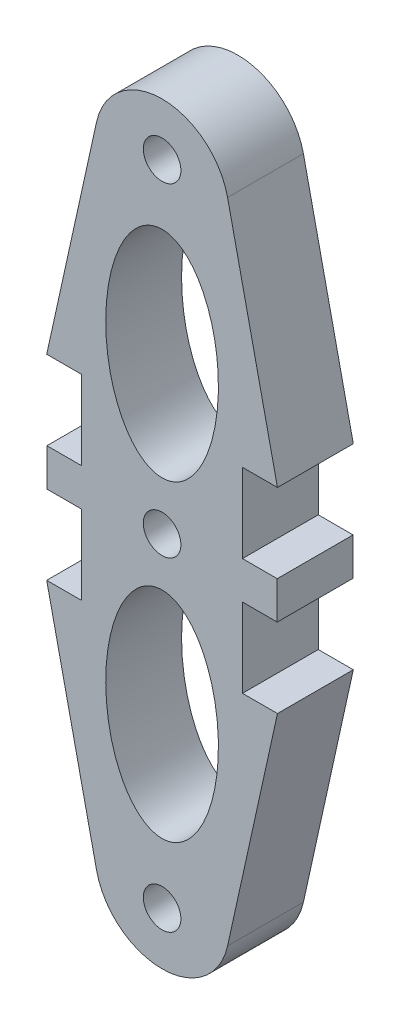
ISO-10303-21;
HEADER;
FILE_DESCRIPTION(('STEP AP214'),'2;1');
FILE_NAME('part.step','',(''),(''),'','','');
FILE_SCHEMA(('AUTOMOTIVE_DESIGN { 1 0 10303 214 1 1 1 1 }'));
ENDSEC;
DATA;
#1=APPLICATION_CONTEXT('core data for automotive mechanical design processes');
#2=APPLICATION_PROTOCOL_DEFINITION('international standard','automotive_design',2000,#1);
#3=PRODUCT_CONTEXT('',#1,'mechanical');
#4=PRODUCT('Part','Part','',(#3));
#5=PRODUCT_RELATED_PRODUCT_CATEGORY('part','',(#4));
#6=PRODUCT_DEFINITION_FORMATION('','',#4);
#7=PRODUCT_DEFINITION_CONTEXT('part definition',#1,'design');
#8=PRODUCT_DEFINITION('design','',#6,#7);
#9=PRODUCT_DEFINITION_SHAPE('','',#8);
#10=(LENGTH_UNIT() NAMED_UNIT(*) SI_UNIT(.MILLI.,.METRE.));
#11=(NAMED_UNIT(*) PLANE_ANGLE_UNIT() SI_UNIT($,.RADIAN.));
#12=(NAMED_UNIT(*) SI_UNIT($,.STERADIAN.) SOLID_ANGLE_UNIT());
#13=UNCERTAINTY_MEASURE_WITH_UNIT(LENGTH_MEASURE(1.E-05),#10,'distance_accuracy_value','');
#14=(GEOMETRIC_REPRESENTATION_CONTEXT(3) GLOBAL_UNCERTAINTY_ASSIGNED_CONTEXT((#13)) GLOBAL_UNIT_ASSIGNED_CONTEXT((#10,
#11,#12)) REPRESENTATION_CONTEXT('',''));
#15=CARTESIAN_POINT('',(0.,0.,0.));
#16=DIRECTION('',(0.,0.,1.));
#17=DIRECTION('',(1.,0.,0.));
#18=AXIS2_PLACEMENT_3D('',#15,#16,#17);
#19=CARTESIAN_POINT('',(787.554942027918,415.958636761701,5.85));
#20=DIRECTION('',(0.976545974076445,0.215308988467939,0.));
#21=DIRECTION('',(-0.215308988467939,0.976545974076445,0.));
#22=AXIS2_PLACEMENT_3D('',#19,#20,#21);
#23=PLANE('',#22);
#24=DIRECTION('',(0.215308988467939,-0.976545974076445,0.));
#25=VECTOR('',#24,1.);
#26=CARTESIAN_POINT('',(787.554942027918,415.958636761701,0.));
#27=LINE('',#26,#25);
#28=CARTESIAN_POINT('',(778.759168708765,455.852359196733,0.));
#29=VERTEX_POINT('',#28);
#30=CARTESIAN_POINT('',(782.606547069337,438.402359196733,0.));
#31=VERTEX_POINT('',#30);
#32=EDGE_CURVE('E313',#29,#31,#27,.T.);
#33=ORIENTED_EDGE('',*,*,#32,.T.);
#34=DIRECTION('',(0.,0.,-1.));
#35=VECTOR('',#34,1.);
#36=CARTESIAN_POINT('',(782.606547069337,438.402359196733,5.85));
#37=LINE('',#36,#35);
#38=CARTESIAN_POINT('',(782.606547069337,438.402359196733,5.85));
#39=VERTEX_POINT('',#38);
#40=EDGE_CURVE('E11',#39,#31,#37,.T.);
#41=ORIENTED_EDGE('',*,*,#40,.F.);
#42=DIRECTION('',(0.215308988467939,-0.976545974076445,0.));
#43=VECTOR('',#42,1.);
#44=CARTESIAN_POINT('',(787.554942027918,415.958636761701,5.85));
#45=LINE('',#44,#43);
#46=CARTESIAN_POINT('',(778.759168708765,455.852359196733,5.85));
#47=VERTEX_POINT('',#46);
#48=EDGE_CURVE('E468',#47,#39,#45,.T.);
#49=ORIENTED_EDGE('',*,*,#48,.F.);
#50=DIRECTION('',(0.,0.,-1.));
#51=VECTOR('',#50,1.);
#52=CARTESIAN_POINT('',(778.759168708765,455.852359196733,5.85));
#53=LINE('',#52,#51);
#54=EDGE_CURVE('E378',#47,#29,#53,.T.);
#55=ORIENTED_EDGE('',*,*,#54,.T.);
#56=EDGE_LOOP('',(#33,#41,#49,#55));
#57=FACE_BOUND('',#56,.T.);
#58=ADVANCED_FACE('F34',(#57),#23,.F.);
#59=CARTESIAN_POINT('',(787.659168708765,439.516361899294,5.85));
#60=DIRECTION('',(0.,0.,-1.));
#61=DIRECTION('',(-1.,0.,0.));
#62=AXIS2_PLACEMENT_3D('',#59,#60,#61);
#63=CYLINDRICAL_SURFACE('',#62,5.17397211555384);
#64=CARTESIAN_POINT('',(787.659168708765,439.516361899294,0.));
#65=DIRECTION('',(0.,0.,1.));
#66=DIRECTION('',(1.,0.,0.));
#67=AXIS2_PLACEMENT_3D('',#64,#65,#66);
#68=CIRCLE('',#67,5.17397211555384);
#69=CARTESIAN_POINT('',(792.711790348193,438.402359196733,0.));
#70=VERTEX_POINT('',#69);
#71=EDGE_CURVE('E317',#31,#70,#68,.T.);
#72=ORIENTED_EDGE('',*,*,#71,.T.);
#73=DIRECTION('',(0.,0.,-1.));
#74=VECTOR('',#73,1.);
#75=CARTESIAN_POINT('',(792.711790348193,438.402359196733,5.85));
#76=LINE('',#75,#74);
#77=CARTESIAN_POINT('',(792.711790348193,438.402359196733,5.85));
#78=VERTEX_POINT('',#77);
#79=EDGE_CURVE('E43',#78,#70,#76,.T.);
#80=ORIENTED_EDGE('',*,*,#79,.F.);
#81=CARTESIAN_POINT('',(787.659168708765,439.516361899294,5.85));
#82=DIRECTION('',(0.,0.,1.));
#83=DIRECTION('',(1.,0.,0.));
#84=AXIS2_PLACEMENT_3D('',#81,#82,#83);
#85=CIRCLE('',#84,5.17397211555384);
#86=EDGE_CURVE('E129',#39,#78,#85,.T.);
#87=ORIENTED_EDGE('',*,*,#86,.F.);
#88=ORIENTED_EDGE('',*,*,#40,.T.);
#89=EDGE_LOOP('',(#72,#80,#87,#88));
#90=FACE_BOUND('',#89,.T.);
#91=ADVANCED_FACE('F293',(#90),#63,.T.);
#92=CARTESIAN_POINT('',(787.763395389613,415.958636761701,5.85));
#93=DIRECTION('',(-0.976545974076445,0.215308988467939,0.));
#94=DIRECTION('',(-0.215308988467939,-0.976545974076445,0.));
#95=AXIS2_PLACEMENT_3D('',#92,#93,#94);
#96=PLANE('',#95);
#97=DIRECTION('',(0.215308988467939,0.976545974076445,0.));
#98=VECTOR('',#97,1.);
#99=CARTESIAN_POINT('',(787.763395389613,415.958636761701,0.));
#100=LINE('',#99,#98);
#101=CARTESIAN_POINT('',(796.559168708765,455.852359196733,0.));
#102=VERTEX_POINT('',#101);
#103=EDGE_CURVE('E322',#70,#102,#100,.T.);
#104=ORIENTED_EDGE('',*,*,#103,.T.);
#105=DIRECTION('',(0.,0.,-1.));
#106=VECTOR('',#105,1.);
#107=CARTESIAN_POINT('',(796.559168708765,455.852359196733,5.85));
#108=LINE('',#107,#106);
#109=CARTESIAN_POINT('',(796.559168708765,455.852359196733,5.85));
#110=VERTEX_POINT('',#109);
#111=EDGE_CURVE('E410',#110,#102,#108,.T.);
#112=ORIENTED_EDGE('',*,*,#111,.F.);
#113=DIRECTION('',(0.215308988467939,0.976545974076445,0.));
#114=VECTOR('',#113,1.);
#115=CARTESIAN_POINT('',(787.763395389613,415.958636761701,5.85));
#116=LINE('',#115,#114);
#117=EDGE_CURVE('E415',#78,#110,#116,.T.);
#118=ORIENTED_EDGE('',*,*,#117,.F.);
#119=ORIENTED_EDGE('',*,*,#79,.T.);
#120=EDGE_LOOP('',(#104,#112,#118,#119));
#121=FACE_BOUND('',#120,.T.);
#122=ADVANCED_FACE('F289',(#121),#96,.F.);
#123=CARTESIAN_POINT('',(787.659168708766,455.852359196733,5.85));
#124=DIRECTION('',(0.,1.,0.));
#125=DIRECTION('',(-1.,0.,0.));
#126=AXIS2_PLACEMENT_3D('',#123,#124,#125);
#127=PLANE('',#126);
#128=DIRECTION('',(1.,0.,0.));
#129=VECTOR('',#128,1.);
#130=CARTESIAN_POINT('',(787.659168708766,455.852359196733,0.));
#131=LINE('',#130,#129);
#132=CARTESIAN_POINT('',(793.859168708765,455.852359196733,0.));
#133=VERTEX_POINT('',#132);
#134=EDGE_CURVE('E325',#133,#102,#131,.T.);
#135=ORIENTED_EDGE('',*,*,#134,.F.);
#136=DIRECTION('',(0.,0.,-1.));
#137=VECTOR('',#136,1.);
#138=CARTESIAN_POINT('',(793.859168708765,455.852359196733,5.85));
#139=LINE('',#138,#137);
#140=CARTESIAN_POINT('',(793.859168708765,455.852359196733,5.85));
#141=VERTEX_POINT('',#140);
#142=EDGE_CURVE('E408',#141,#133,#139,.T.);
#143=ORIENTED_EDGE('',*,*,#142,.F.);
#144=DIRECTION('',(1.,0.,0.));
#145=VECTOR('',#144,1.);
#146=CARTESIAN_POINT('',(787.659168708766,455.852359196733,5.85));
#147=LINE('',#146,#145);
#148=EDGE_CURVE('E425',#141,#110,#147,.T.);
#149=ORIENTED_EDGE('',*,*,#148,.T.);
#150=ORIENTED_EDGE('',*,*,#111,.T.);
#151=EDGE_LOOP('',(#135,#143,#149,#150));
#152=FACE_BOUND('',#151,.T.);
#153=ADVANCED_FACE('F285',(#152),#127,.T.);
#154=CARTESIAN_POINT('',(793.859168708765,415.981616674393,5.85));
#155=DIRECTION('',(1.,0.,0.));
#156=DIRECTION('',(0.,0.,-1.));
#157=AXIS2_PLACEMENT_3D('',#154,#155,#156);
#158=PLANE('',#157);
#159=DIRECTION('',(0.,-1.,0.));
#160=VECTOR('',#159,1.);
#161=CARTESIAN_POINT('',(793.859168708765,415.981616674393,0.));
#162=LINE('',#161,#160);
#163=CARTESIAN_POINT('',(793.859168708765,461.952359196733,0.));
#164=VERTEX_POINT('',#163);
#165=EDGE_CURVE('E328',#164,#133,#162,.T.);
#166=ORIENTED_EDGE('',*,*,#165,.F.);
#167=DIRECTION('',(0.,0.,-1.));
#168=VECTOR('',#167,1.);
#169=CARTESIAN_POINT('',(793.859168708765,461.952359196733,5.85));
#170=LINE('',#169,#168);
#171=CARTESIAN_POINT('',(793.859168708765,461.952359196733,5.85));
#172=VERTEX_POINT('',#171);
#173=EDGE_CURVE('E406',#172,#164,#170,.T.);
#174=ORIENTED_EDGE('',*,*,#173,.F.);
#175=DIRECTION('',(0.,-1.,0.));
#176=VECTOR('',#175,1.);
#177=CARTESIAN_POINT('',(793.859168708765,415.981616674393,5.85));
#178=LINE('',#177,#176);
#179=EDGE_CURVE('E428',#172,#141,#178,.T.);
#180=ORIENTED_EDGE('',*,*,#179,.T.);
#181=ORIENTED_EDGE('',*,*,#142,.T.);
#182=EDGE_LOOP('',(#166,#174,#180,#181));
#183=FACE_BOUND('',#182,.T.);
#184=ADVANCED_FACE('F281',(#183),#158,.T.);
#185=CARTESIAN_POINT('',(787.659168708766,461.952359196733,5.85));
#186=DIRECTION('',(0.,1.,0.));
#187=DIRECTION('',(-1.,0.,0.));
#188=AXIS2_PLACEMENT_3D('',#185,#186,#187);
#189=PLANE('',#188);
#190=DIRECTION('',(1.,0.,0.));
#191=VECTOR('',#190,1.);
#192=CARTESIAN_POINT('',(787.659168708766,461.952359196733,0.));
#193=LINE('',#192,#191);
#194=CARTESIAN_POINT('',(796.542244464242,461.952359196733,0.));
#195=VERTEX_POINT('',#194);
#196=EDGE_CURVE('E331',#164,#195,#193,.T.);
#197=ORIENTED_EDGE('',*,*,#196,.T.);
#198=DIRECTION('',(0.,0.,-1.));
#199=VECTOR('',#198,1.);
#200=CARTESIAN_POINT('',(796.542244464242,461.952359196733,5.85));
#201=LINE('',#200,#199);
#202=CARTESIAN_POINT('',(796.542244464242,461.952359196733,5.85));
#203=VERTEX_POINT('',#202);
#204=EDGE_CURVE('E404',#203,#195,#201,.T.);
#205=ORIENTED_EDGE('',*,*,#204,.F.);
#206=DIRECTION('',(1.,0.,0.));
#207=VECTOR('',#206,1.);
#208=CARTESIAN_POINT('',(787.659168708766,461.952359196733,5.85));
#209=LINE('',#208,#207);
#210=EDGE_CURVE('E430',#172,#203,#209,.T.);
#211=ORIENTED_EDGE('',*,*,#210,.F.);
#212=ORIENTED_EDGE('',*,*,#173,.T.);
#213=EDGE_LOOP('',(#197,#205,#211,#212));
#214=FACE_BOUND('',#213,.T.);
#215=ADVANCED_FACE('F277',(#214),#189,.F.);
#216=CARTESIAN_POINT('',(796.542244464242,415.981616674393,5.85));
#217=DIRECTION('',(1.,0.,0.));
#218=DIRECTION('',(0.,0.,-1.));
#219=AXIS2_PLACEMENT_3D('',#216,#217,#218);
#220=PLANE('',#219);
#221=DIRECTION('',(0.,-1.,0.));
#222=VECTOR('',#221,1.);
#223=CARTESIAN_POINT('',(796.542244464242,415.981616674393,0.));
#224=LINE('',#223,#222);
#225=CARTESIAN_POINT('',(796.542244464242,464.852359196733,0.));
#226=VERTEX_POINT('',#225);
#227=EDGE_CURVE('E334',#226,#195,#224,.T.);
#228=ORIENTED_EDGE('',*,*,#227,.F.);
#229=DIRECTION('',(0.,0.,-1.));
#230=VECTOR('',#229,1.);
#231=CARTESIAN_POINT('',(796.542244464242,464.852359196733,5.85));
#232=LINE('',#231,#230);
#233=CARTESIAN_POINT('',(796.542244464242,464.852359196733,5.85));
#234=VERTEX_POINT('',#233);
#235=EDGE_CURVE('E402',#234,#226,#232,.T.);
#236=ORIENTED_EDGE('',*,*,#235,.F.);
#237=DIRECTION('',(0.,-1.,0.));
#238=VECTOR('',#237,1.);
#239=CARTESIAN_POINT('',(796.542244464242,415.981616674393,5.85));
#240=LINE('',#239,#238);
#241=EDGE_CURVE('E436',#234,#203,#240,.T.);
#242=ORIENTED_EDGE('',*,*,#241,.T.);
#243=ORIENTED_EDGE('',*,*,#204,.T.);
#244=EDGE_LOOP('',(#228,#236,#242,#243));
#245=FACE_BOUND('',#244,.T.);
#246=ADVANCED_FACE('F273',(#245),#220,.T.);
#247=CARTESIAN_POINT('',(787.659168708764,464.852359196733,5.85));
#248=DIRECTION('',(0.,1.,0.));
#249=DIRECTION('',(-1.,0.,0.));
#250=AXIS2_PLACEMENT_3D('',#247,#248,#249);
#251=PLANE('',#250);
#252=DIRECTION('',(1.,0.,0.));
#253=VECTOR('',#252,1.);
#254=CARTESIAN_POINT('',(787.659168708764,464.852359196733,0.));
#255=LINE('',#254,#253);
#256=CARTESIAN_POINT('',(793.859168708765,464.852359196733,0.));
#257=VERTEX_POINT('',#256);
#258=EDGE_CURVE('E337',#257,#226,#255,.T.);
#259=ORIENTED_EDGE('',*,*,#258,.F.);
#260=DIRECTION('',(0.,0.,-1.));
#261=VECTOR('',#260,1.);
#262=CARTESIAN_POINT('',(793.859168708765,464.852359196733,5.85));
#263=LINE('',#262,#261);
#264=CARTESIAN_POINT('',(793.859168708765,464.852359196733,5.85));
#265=VERTEX_POINT('',#264);
#266=EDGE_CURVE('E400',#265,#257,#263,.T.);
#267=ORIENTED_EDGE('',*,*,#266,.F.);
#268=DIRECTION('',(1.,0.,0.));
#269=VECTOR('',#268,1.);
#270=CARTESIAN_POINT('',(787.659168708764,464.852359196733,5.85));
#271=LINE('',#270,#269);
#272=EDGE_CURVE('E439',#265,#234,#271,.T.);
#273=ORIENTED_EDGE('',*,*,#272,.T.);
#274=ORIENTED_EDGE('',*,*,#235,.T.);
#275=EDGE_LOOP('',(#259,#267,#273,#274));
#276=FACE_BOUND('',#275,.T.);
#277=ADVANCED_FACE('F269',(#276),#251,.T.);
#278=CARTESIAN_POINT('',(793.859168708765,415.981616674393,5.85));
#279=DIRECTION('',(-1.,0.,0.));
#280=DIRECTION('',(0.,0.,1.));
#281=AXIS2_PLACEMENT_3D('',#278,#279,#280);
#282=PLANE('',#281);
#283=DIRECTION('',(0.,1.,0.));
#284=VECTOR('',#283,1.);
#285=CARTESIAN_POINT('',(793.859168708765,415.981616674393,0.));
#286=LINE('',#285,#284);
#287=CARTESIAN_POINT('',(793.859168708765,470.952359196733,0.));
#288=VERTEX_POINT('',#287);
#289=EDGE_CURVE('E340',#257,#288,#286,.T.);
#290=ORIENTED_EDGE('',*,*,#289,.T.);
#291=DIRECTION('',(0.,0.,-1.));
#292=VECTOR('',#291,1.);
#293=CARTESIAN_POINT('',(793.859168708765,470.952359196733,5.85));
#294=LINE('',#293,#292);
#295=CARTESIAN_POINT('',(793.859168708765,470.952359196733,5.85));
#296=VERTEX_POINT('',#295);
#297=EDGE_CURVE('E397',#296,#288,#294,.T.);
#298=ORIENTED_EDGE('',*,*,#297,.F.);
#299=DIRECTION('',(0.,1.,0.));
#300=VECTOR('',#299,1.);
#301=CARTESIAN_POINT('',(793.859168708765,415.981616674393,5.85));
#302=LINE('',#301,#300);
#303=EDGE_CURVE('E442',#265,#296,#302,.T.);
#304=ORIENTED_EDGE('',*,*,#303,.F.);
#305=ORIENTED_EDGE('',*,*,#266,.T.);
#306=EDGE_LOOP('',(#290,#298,#304,#305));
#307=FACE_BOUND('',#306,.T.);
#308=ADVANCED_FACE('F265',(#307),#282,.F.);
#309=CARTESIAN_POINT('',(787.659168708764,470.952359196733,5.85));
#310=DIRECTION('',(0.,1.,0.));
#311=DIRECTION('',(-1.,0.,0.));
#312=AXIS2_PLACEMENT_3D('',#309,#310,#311);
#313=PLANE('',#312);
#314=DIRECTION('',(1.,0.,0.));
#315=VECTOR('',#314,1.);
#316=CARTESIAN_POINT('',(787.659168708764,470.952359196733,0.));
#317=LINE('',#316,#315);
#318=CARTESIAN_POINT('',(796.559168708765,470.952359196733,0.));
#319=VERTEX_POINT('',#318);
#320=EDGE_CURVE('E342',#288,#319,#317,.T.);
#321=ORIENTED_EDGE('',*,*,#320,.T.);
#322=DIRECTION('',(0.,0.,-1.));
#323=VECTOR('',#322,1.);
#324=CARTESIAN_POINT('',(796.559168708765,470.952359196733,5.85));
#325=LINE('',#324,#323);
#326=CARTESIAN_POINT('',(796.559168708765,470.952359196733,5.85));
#327=VERTEX_POINT('',#326);
#328=EDGE_CURVE('E395',#327,#319,#325,.T.);
#329=ORIENTED_EDGE('',*,*,#328,.F.);
#330=DIRECTION('',(1.,0.,0.));
#331=VECTOR('',#330,1.);
#332=CARTESIAN_POINT('',(787.659168708764,470.952359196733,5.85));
#333=LINE('',#332,#331);
#334=EDGE_CURVE('E444',#296,#327,#333,.T.);
#335=ORIENTED_EDGE('',*,*,#334,.F.);
#336=ORIENTED_EDGE('',*,*,#297,.T.);
#337=EDGE_LOOP('',(#321,#329,#335,#336));
#338=FACE_BOUND('',#337,.T.);
#339=ADVANCED_FACE('F261',(#338),#313,.F.);
#340=CARTESIAN_POINT('',(807.704683131399,420.40125440598,5.85));
#341=DIRECTION('',(0.976545974076445,0.21530898846794,0.));
#342=DIRECTION('',(-0.21530898846794,0.976545974076445,0.));
#343=AXIS2_PLACEMENT_3D('',#340,#341,#342);
#344=PLANE('',#343);
#345=DIRECTION('',(0.21530898846794,-0.976545974076445,0.));
#346=VECTOR('',#345,1.);
#347=CARTESIAN_POINT('',(807.704683131399,420.40125440598,0.));
#348=LINE('',#347,#346);
#349=CARTESIAN_POINT('',(792.711790348193,488.402359196733,0.));
#350=VERTEX_POINT('',#349);
#351=EDGE_CURVE('E345',#350,#319,#348,.T.);
#352=ORIENTED_EDGE('',*,*,#351,.F.);
#353=DIRECTION('',(0.,0.,-1.));
#354=VECTOR('',#353,1.);
#355=CARTESIAN_POINT('',(792.711790348193,488.402359196733,5.85));
#356=LINE('',#355,#354);
#357=CARTESIAN_POINT('',(792.711790348193,488.402359196733,5.85));
#358=VERTEX_POINT('',#357);
#359=EDGE_CURVE('E393',#358,#350,#356,.T.);
#360=ORIENTED_EDGE('',*,*,#359,.F.);
#361=DIRECTION('',(0.21530898846794,-0.976545974076445,0.));
#362=VECTOR('',#361,1.);
#363=CARTESIAN_POINT('',(807.704683131399,420.40125440598,5.85));
#364=LINE('',#363,#362);
#365=EDGE_CURVE('E446',#358,#327,#364,.T.);
#366=ORIENTED_EDGE('',*,*,#365,.T.);
#367=ORIENTED_EDGE('',*,*,#328,.T.);
#368=EDGE_LOOP('',(#352,#360,#366,#367));
#369=FACE_BOUND('',#368,.T.);
#370=ADVANCED_FACE('F257',(#369),#344,.T.);
#371=CARTESIAN_POINT('',(787.659168708765,487.288356494172,5.85));
#372=DIRECTION('',(0.,0.,-1.));
#373=DIRECTION('',(-1.,0.,0.));
#374=AXIS2_PLACEMENT_3D('',#371,#372,#373);
#375=CYLINDRICAL_SURFACE('',#374,5.17397211555384);
#376=CARTESIAN_POINT('',(787.659168708765,487.288356494172,0.));
#377=DIRECTION('',(0.,0.,1.));
#378=DIRECTION('',(1.,0.,0.));
#379=AXIS2_PLACEMENT_3D('',#376,#377,#378);
#380=CIRCLE('',#379,5.17397211555384);
#381=CARTESIAN_POINT('',(782.606547069337,488.402359196733,0.));
#382=VERTEX_POINT('',#381);
#383=EDGE_CURVE('E348',#382,#350,#380,.F.);
#384=ORIENTED_EDGE('',*,*,#383,.F.);
#385=DIRECTION('',(0.,0.,-1.));
#386=VECTOR('',#385,1.);
#387=CARTESIAN_POINT('',(782.606547069337,488.402359196733,5.85));
#388=LINE('',#387,#386);
#389=CARTESIAN_POINT('',(782.606547069337,488.402359196733,5.85));
#390=VERTEX_POINT('',#389);
#391=EDGE_CURVE('E391',#390,#382,#388,.T.);
#392=ORIENTED_EDGE('',*,*,#391,.F.);
#393=CARTESIAN_POINT('',(787.659168708765,487.288356494172,5.85));
#394=DIRECTION('',(0.,0.,1.));
#395=DIRECTION('',(1.,0.,0.));
#396=AXIS2_PLACEMENT_3D('',#393,#394,#395);
#397=CIRCLE('',#396,5.17397211555384);
#398=EDGE_CURVE('E449',#390,#358,#397,.F.);
#399=ORIENTED_EDGE('',*,*,#398,.T.);
#400=ORIENTED_EDGE('',*,*,#359,.T.);
#401=EDGE_LOOP('',(#384,#392,#399,#400));
#402=FACE_BOUND('',#401,.T.);
#403=ADVANCED_FACE('F253',(#402),#375,.T.);
#404=CARTESIAN_POINT('',(767.613654286132,420.40125440598,5.85));
#405=DIRECTION('',(-0.976545974076445,0.21530898846794,0.));
#406=DIRECTION('',(-0.21530898846794,-0.976545974076445,0.));
#407=AXIS2_PLACEMENT_3D('',#404,#405,#406);
#408=PLANE('',#407);
#409=DIRECTION('',(0.21530898846794,0.976545974076445,0.));
#410=VECTOR('',#409,1.);
#411=CARTESIAN_POINT('',(767.613654286132,420.40125440598,0.));
#412=LINE('',#411,#410);
#413=CARTESIAN_POINT('',(778.759168708765,470.952359196733,0.));
#414=VERTEX_POINT('',#413);
#415=EDGE_CURVE('E351',#414,#382,#412,.T.);
#416=ORIENTED_EDGE('',*,*,#415,.F.);
#417=DIRECTION('',(0.,0.,-1.));
#418=VECTOR('',#417,1.);
#419=CARTESIAN_POINT('',(778.759168708765,470.952359196733,5.85));
#420=LINE('',#419,#418);
#421=CARTESIAN_POINT('',(778.759168708765,470.952359196733,5.85));
#422=VERTEX_POINT('',#421);
#423=EDGE_CURVE('E389',#422,#414,#420,.T.);
#424=ORIENTED_EDGE('',*,*,#423,.F.);
#425=DIRECTION('',(0.21530898846794,0.976545974076445,0.));
#426=VECTOR('',#425,1.);
#427=CARTESIAN_POINT('',(767.613654286132,420.40125440598,5.85));
#428=LINE('',#427,#426);
#429=EDGE_CURVE('E452',#422,#390,#428,.T.);
#430=ORIENTED_EDGE('',*,*,#429,.T.);
#431=ORIENTED_EDGE('',*,*,#391,.T.);
#432=EDGE_LOOP('',(#416,#424,#430,#431));
#433=FACE_BOUND('',#432,.T.);
#434=ADVANCED_FACE('F249',(#433),#408,.T.);
#435=CARTESIAN_POINT('',(787.659168708767,470.952359196733,5.85));
#436=DIRECTION('',(0.,-1.,0.));
#437=DIRECTION('',(1.,0.,0.));
#438=AXIS2_PLACEMENT_3D('',#435,#436,#437);
#439=PLANE('',#438);
#440=DIRECTION('',(-1.,0.,0.));
#441=VECTOR('',#440,1.);
#442=CARTESIAN_POINT('',(787.659168708767,470.952359196733,0.));
#443=LINE('',#442,#441);
#444=CARTESIAN_POINT('',(781.459168708765,470.952359196733,0.));
#445=VERTEX_POINT('',#444);
#446=EDGE_CURVE('E354',#445,#414,#443,.T.);
#447=ORIENTED_EDGE('',*,*,#446,.F.);
#448=DIRECTION('',(0.,0.,-1.));
#449=VECTOR('',#448,1.);
#450=CARTESIAN_POINT('',(781.459168708765,470.952359196733,5.85));
#451=LINE('',#450,#449);
#452=CARTESIAN_POINT('',(781.459168708765,470.952359196733,5.85));
#453=VERTEX_POINT('',#452);
#454=EDGE_CURVE('E387',#453,#445,#451,.T.);
#455=ORIENTED_EDGE('',*,*,#454,.F.);
#456=DIRECTION('',(-1.,0.,0.));
#457=VECTOR('',#456,1.);
#458=CARTESIAN_POINT('',(787.659168708767,470.952359196733,5.85));
#459=LINE('',#458,#457);
#460=EDGE_CURVE('E455',#453,#422,#459,.T.);
#461=ORIENTED_EDGE('',*,*,#460,.T.);
#462=ORIENTED_EDGE('',*,*,#423,.T.);
#463=EDGE_LOOP('',(#447,#455,#461,#462));
#464=FACE_BOUND('',#463,.T.);
#465=ADVANCED_FACE('F245',(#464),#439,.T.);
#466=CARTESIAN_POINT('',(781.459168708765,415.981616674393,5.85));
#467=DIRECTION('',(-1.,0.,0.));
#468=DIRECTION('',(0.,0.,1.));
#469=AXIS2_PLACEMENT_3D('',#466,#467,#468);
#470=PLANE('',#469);
#471=DIRECTION('',(0.,1.,0.));
#472=VECTOR('',#471,1.);
#473=CARTESIAN_POINT('',(781.459168708765,415.981616674393,0.));
#474=LINE('',#473,#472);
#475=CARTESIAN_POINT('',(781.459168708765,464.852359196733,0.));
#476=VERTEX_POINT('',#475);
#477=EDGE_CURVE('E357',#476,#445,#474,.T.);
#478=ORIENTED_EDGE('',*,*,#477,.F.);
#479=DIRECTION('',(0.,0.,-1.));
#480=VECTOR('',#479,1.);
#481=CARTESIAN_POINT('',(781.459168708765,464.852359196733,5.85));
#482=LINE('',#481,#480);
#483=CARTESIAN_POINT('',(781.459168708765,464.852359196733,5.85));
#484=VERTEX_POINT('',#483);
#485=EDGE_CURVE('E385',#484,#476,#482,.T.);
#486=ORIENTED_EDGE('',*,*,#485,.F.);
#487=DIRECTION('',(0.,1.,0.));
#488=VECTOR('',#487,1.);
#489=CARTESIAN_POINT('',(781.459168708765,415.981616674393,5.85));
#490=LINE('',#489,#488);
#491=EDGE_CURVE('E458',#484,#453,#490,.T.);
#492=ORIENTED_EDGE('',*,*,#491,.T.);
#493=ORIENTED_EDGE('',*,*,#454,.T.);
#494=EDGE_LOOP('',(#478,#486,#492,#493));
#495=FACE_BOUND('',#494,.T.);
#496=ADVANCED_FACE('F241',(#495),#470,.T.);
#497=CARTESIAN_POINT('',(787.659168708766,464.852359196733,5.85));
#498=DIRECTION('',(0.,-1.,0.));
#499=DIRECTION('',(1.,0.,0.));
#500=AXIS2_PLACEMENT_3D('',#497,#498,#499);
#501=PLANE('',#500);
#502=DIRECTION('',(-1.,0.,0.));
#503=VECTOR('',#502,1.);
#504=CARTESIAN_POINT('',(787.659168708766,464.852359196733,0.));
#505=LINE('',#504,#503);
#506=CARTESIAN_POINT('',(778.776092953289,464.852359196733,0.));
#507=VERTEX_POINT('',#506);
#508=EDGE_CURVE('E360',#476,#507,#505,.T.);
#509=ORIENTED_EDGE('',*,*,#508,.T.);
#510=DIRECTION('',(0.,0.,-1.));
#511=VECTOR('',#510,1.);
#512=CARTESIAN_POINT('',(778.776092953289,464.852359196733,5.85));
#513=LINE('',#512,#511);
#514=CARTESIAN_POINT('',(778.776092953289,464.852359196733,5.85));
#515=VERTEX_POINT('',#514);
#516=EDGE_CURVE('E382',#515,#507,#513,.T.);
#517=ORIENTED_EDGE('',*,*,#516,.F.);
#518=DIRECTION('',(-1.,0.,0.));
#519=VECTOR('',#518,1.);
#520=CARTESIAN_POINT('',(787.659168708766,464.852359196733,5.85));
#521=LINE('',#520,#519);
#522=EDGE_CURVE('E199',#484,#515,#521,.T.);
#523=ORIENTED_EDGE('',*,*,#522,.F.);
#524=ORIENTED_EDGE('',*,*,#485,.T.);
#525=EDGE_LOOP('',(#509,#517,#523,#524));
#526=FACE_BOUND('',#525,.T.);
#527=ADVANCED_FACE('F237',(#526),#501,.F.);
#528=CARTESIAN_POINT('',(778.776092953289,415.981616674393,5.85));
#529=DIRECTION('',(1.,0.,0.));
#530=DIRECTION('',(0.,0.,-1.));
#531=AXIS2_PLACEMENT_3D('',#528,#529,#530);
#532=PLANE('',#531);
#533=DIRECTION('',(0.,-1.,0.));
#534=VECTOR('',#533,1.);
#535=CARTESIAN_POINT('',(778.776092953289,415.981616674393,0.));
#536=LINE('',#535,#534);
#537=CARTESIAN_POINT('',(778.776092953289,461.952359196733,0.));
#538=VERTEX_POINT('',#537);
#539=EDGE_CURVE('E362',#507,#538,#536,.T.);
#540=ORIENTED_EDGE('',*,*,#539,.T.);
#541=DIRECTION('',(0.,0.,-1.));
#542=VECTOR('',#541,1.);
#543=CARTESIAN_POINT('',(778.776092953289,461.952359196733,5.85));
#544=LINE('',#543,#542);
#545=CARTESIAN_POINT('',(778.776092953289,461.952359196733,5.85));
#546=VERTEX_POINT('',#545);
#547=EDGE_CURVE('E187',#546,#538,#544,.T.);
#548=ORIENTED_EDGE('',*,*,#547,.F.);
#549=DIRECTION('',(0.,-1.,0.));
#550=VECTOR('',#549,1.);
#551=CARTESIAN_POINT('',(778.776092953289,415.981616674393,5.85));
#552=LINE('',#551,#550);
#553=EDGE_CURVE('E196',#515,#546,#552,.T.);
#554=ORIENTED_EDGE('',*,*,#553,.F.);
#555=ORIENTED_EDGE('',*,*,#516,.T.);
#556=EDGE_LOOP('',(#540,#548,#554,#555));
#557=FACE_BOUND('',#556,.T.);
#558=ADVANCED_FACE('F234',(#557),#532,.F.);
#559=CARTESIAN_POINT('',(787.659168708764,461.952359196733,5.85));
#560=DIRECTION('',(0.,-1.,0.));
#561=DIRECTION('',(1.,0.,0.));
#562=AXIS2_PLACEMENT_3D('',#559,#560,#561);
#563=PLANE('',#562);
#564=DIRECTION('',(-1.,0.,0.));
#565=VECTOR('',#564,1.);
#566=CARTESIAN_POINT('',(787.659168708764,461.952359196733,0.));
#567=LINE('',#566,#565);
#568=CARTESIAN_POINT('',(781.459168708765,461.952359196733,0.));
#569=VERTEX_POINT('',#568);
#570=EDGE_CURVE('E186',#569,#538,#567,.T.);
#571=ORIENTED_EDGE('',*,*,#570,.F.);
#572=DIRECTION('',(0.,0.,-1.));
#573=VECTOR('',#572,1.);
#574=CARTESIAN_POINT('',(781.459168708765,461.952359196733,5.85));
#575=LINE('',#574,#573);
#576=CARTESIAN_POINT('',(781.459168708765,461.952359196733,5.85));
#577=VERTEX_POINT('',#576);
#578=EDGE_CURVE('E180',#577,#569,#575,.T.);
#579=ORIENTED_EDGE('',*,*,#578,.F.);
#580=DIRECTION('',(-1.,0.,0.));
#581=VECTOR('',#580,1.);
#582=CARTESIAN_POINT('',(787.659168708764,461.952359196733,5.85));
#583=LINE('',#582,#581);
#584=EDGE_CURVE('E184',#577,#546,#583,.T.);
#585=ORIENTED_EDGE('',*,*,#584,.T.);
#586=ORIENTED_EDGE('',*,*,#547,.T.);
#587=EDGE_LOOP('',(#571,#579,#585,#586));
#588=FACE_BOUND('',#587,.T.);
#589=ADVANCED_FACE('F182',(#588),#563,.T.);
#590=CARTESIAN_POINT('',(781.459168708765,415.981616674393,5.85));
#591=DIRECTION('',(1.,0.,0.));
#592=DIRECTION('',(0.,0.,-1.));
#593=AXIS2_PLACEMENT_3D('',#590,#591,#592);
#594=PLANE('',#593);
#595=DIRECTION('',(0.,-1.,0.));
#596=VECTOR('',#595,1.);
#597=CARTESIAN_POINT('',(781.459168708765,415.981616674393,0.));
#598=LINE('',#597,#596);
#599=CARTESIAN_POINT('',(781.459168708765,455.852359196733,0.));
#600=VERTEX_POINT('',#599);
#601=EDGE_CURVE('E115',#569,#600,#598,.T.);
#602=ORIENTED_EDGE('',*,*,#601,.T.);
#603=DIRECTION('',(0.,0.,-1.));
#604=VECTOR('',#603,1.);
#605=CARTESIAN_POINT('',(781.459168708765,455.852359196733,5.85));
#606=LINE('',#605,#604);
#607=CARTESIAN_POINT('',(781.459168708765,455.852359196733,5.85));
#608=VERTEX_POINT('',#607);
#609=EDGE_CURVE('E188',#608,#600,#606,.T.);
#610=ORIENTED_EDGE('',*,*,#609,.F.);
#611=DIRECTION('',(0.,-1.,0.));
#612=VECTOR('',#611,1.);
#613=CARTESIAN_POINT('',(781.459168708765,415.981616674393,5.85));
#614=LINE('',#613,#612);
#615=EDGE_CURVE('E190',#577,#608,#614,.T.);
#616=ORIENTED_EDGE('',*,*,#615,.F.);
#617=ORIENTED_EDGE('',*,*,#578,.T.);
#618=EDGE_LOOP('',(#602,#610,#616,#617));
#619=FACE_BOUND('',#618,.T.);
#620=ADVANCED_FACE('F191',(#619),#594,.F.);
#621=CARTESIAN_POINT('',(787.659168708765,475.44811823758,5.85));
#622=DIRECTION('',(0.,0.,1.));
#623=DIRECTION('',(0.,1.,0.));
#624=AXIS2_PLACEMENT_3D('',#621,#622,#623);
#625=ELLIPSE('',#624,8.30208055455728,4.34649741649051);
#626=DIRECTION('',(0.,0.,-1.));
#627=VECTOR('',#626,1.);
#628=SURFACE_OF_LINEAR_EXTRUSION('',#625,#627);
#629=CARTESIAN_POINT('',(787.659168708765,483.750198792137,5.85));
#630=VERTEX_POINT('',#629);
#631=EDGE_CURVE('E207',#630,#630,#625,.T.);
#632=ORIENTED_EDGE('',*,*,#631,.T.);
#633=EDGE_LOOP('',(#632));
#634=FACE_BOUND('',#633,.T.);
#635=CARTESIAN_POINT('',(787.659168708765,475.44811823758,0.));
#636=DIRECTION('',(0.,0.,1.));
#637=DIRECTION('',(0.,1.,0.));
#638=AXIS2_PLACEMENT_3D('',#635,#636,#637);
#639=ELLIPSE('',#638,8.30208055455728,4.34649741649051);
#640=CARTESIAN_POINT('',(787.659168708765,483.750198792137,0.));
#641=VERTEX_POINT('',#640);
#642=EDGE_CURVE('E371',#641,#641,#639,.T.);
#643=ORIENTED_EDGE('',*,*,#642,.F.);
#644=EDGE_LOOP('',(#643));
#645=FACE_BOUND('',#644,.T.);
#646=ADVANCED_FACE('F215',(#634,#645),#628,.T.);
#647=CARTESIAN_POINT('',(787.659168708765,463.402359196733,5.85));
#648=DIRECTION('',(0.,0.,-1.));
#649=DIRECTION('',(-1.,0.,0.));
#650=AXIS2_PLACEMENT_3D('',#647,#648,#649);
#651=CYLINDRICAL_SURFACE('',#650,1.44999999999994);
#652=CARTESIAN_POINT('',(787.659168708765,463.402359196733,5.85));
#653=DIRECTION('',(0.,0.,1.));
#654=DIRECTION('',(1.,0.,0.));
#655=AXIS2_PLACEMENT_3D('',#652,#653,#654);
#656=CIRCLE('',#655,1.44999999999994);
#657=CARTESIAN_POINT('',(789.109168708765,463.402359196733,5.85));
#658=VERTEX_POINT('',#657);
#659=EDGE_CURVE('E204',#658,#658,#656,.T.);
#660=ORIENTED_EDGE('',*,*,#659,.T.);
#661=EDGE_LOOP('',(#660));
#662=FACE_BOUND('',#661,.T.);
#663=CARTESIAN_POINT('',(787.659168708765,463.402359196733,0.));
#664=DIRECTION('',(0.,0.,1.));
#665=DIRECTION('',(1.,0.,0.));
#666=AXIS2_PLACEMENT_3D('',#663,#664,#665);
#667=CIRCLE('',#666,1.44999999999994);
#668=CARTESIAN_POINT('',(789.109168708765,463.402359196733,0.));
#669=VERTEX_POINT('',#668);
#670=EDGE_CURVE('E368',#669,#669,#667,.T.);
#671=ORIENTED_EDGE('',*,*,#670,.F.);
#672=EDGE_LOOP('',(#671));
#673=FACE_BOUND('',#672,.T.);
#674=ADVANCED_FACE('F219',(#662,#673),#651,.F.);
#675=CARTESIAN_POINT('',(787.659168708765,455.852359196733,5.85));
#676=DIRECTION('',(0.,-1.,0.));
#677=DIRECTION('',(1.,0.,0.));
#678=AXIS2_PLACEMENT_3D('',#675,#676,#677);
#679=PLANE('',#678);
#680=DIRECTION('',(-1.,0.,0.));
#681=VECTOR('',#680,1.);
#682=CARTESIAN_POINT('',(787.659168708765,455.852359196733,0.));
#683=LINE('',#682,#681);
#684=EDGE_CURVE('E121',#600,#29,#683,.T.);
#685=ORIENTED_EDGE('',*,*,#684,.T.);
#686=ORIENTED_EDGE('',*,*,#54,.F.);
#687=DIRECTION('',(-1.,0.,0.));
#688=VECTOR('',#687,1.);
#689=CARTESIAN_POINT('',(787.659168708765,455.852359196733,5.85));
#690=LINE('',#689,#688);
#691=EDGE_CURVE('E51',#608,#47,#690,.T.);
#692=ORIENTED_EDGE('',*,*,#691,.F.);
#693=ORIENTED_EDGE('',*,*,#609,.T.);
#694=EDGE_LOOP('',(#685,#686,#692,#693));
#695=FACE_BOUND('',#694,.T.);
#696=ADVANCED_FACE('F225',(#695),#679,.F.);
#697=CARTESIAN_POINT('',(787.659168708765,488.402359196733,5.85));
#698=DIRECTION('',(0.,0.,-1.));
#699=DIRECTION('',(-1.,0.,0.));
#700=AXIS2_PLACEMENT_3D('',#697,#698,#699);
#701=CYLINDRICAL_SURFACE('',#700,1.44999999999994);
#702=CARTESIAN_POINT('',(787.659168708765,488.402359196733,5.85));
#703=DIRECTION('',(0.,0.,1.));
#704=DIRECTION('',(1.,0.,0.));
#705=AXIS2_PLACEMENT_3D('',#702,#703,#704);
#706=CIRCLE('',#705,1.44999999999994);
#707=CARTESIAN_POINT('',(789.109168708765,488.402359196733,5.85));
#708=VERTEX_POINT('',#707);
#709=EDGE_CURVE('E308',#708,#708,#706,.T.);
#710=ORIENTED_EDGE('',*,*,#709,.T.);
#711=EDGE_LOOP('',(#710));
#712=FACE_BOUND('',#711,.T.);
#713=CARTESIAN_POINT('',(787.659168708765,488.402359196733,0.));
#714=DIRECTION('',(0.,0.,1.));
#715=DIRECTION('',(1.,0.,0.));
#716=AXIS2_PLACEMENT_3D('',#713,#714,#715);
#717=CIRCLE('',#716,1.44999999999994);
#718=CARTESIAN_POINT('',(789.109168708765,488.402359196733,0.));
#719=VERTEX_POINT('',#718);
#720=EDGE_CURVE('E311',#719,#719,#717,.T.);
#721=ORIENTED_EDGE('',*,*,#720,.F.);
#722=EDGE_LOOP('',(#721));
#723=FACE_BOUND('',#722,.T.);
#724=ADVANCED_FACE('F229',(#712,#723),#701,.F.);
#725=CARTESIAN_POINT('',(787.659168708765,438.402359196733,5.85));
#726=DIRECTION('',(0.,0.,-1.));
#727=DIRECTION('',(-1.,0.,0.));
#728=AXIS2_PLACEMENT_3D('',#725,#726,#727);
#729=CYLINDRICAL_SURFACE('',#728,1.44999999999994);
#730=CARTESIAN_POINT('',(787.659168708765,438.402359196733,5.85));
#731=DIRECTION('',(0.,0.,1.));
#732=DIRECTION('',(1.,0.,0.));
#733=AXIS2_PLACEMENT_3D('',#730,#731,#732);
#734=CIRCLE('',#733,1.44999999999994);
#735=CARTESIAN_POINT('',(789.109168708765,438.402359196733,5.85));
#736=VERTEX_POINT('',#735);
#737=EDGE_CURVE('E377',#736,#736,#734,.F.);
#738=ORIENTED_EDGE('',*,*,#737,.F.);
#739=EDGE_LOOP('',(#738));
#740=FACE_BOUND('',#739,.T.);
#741=CARTESIAN_POINT('',(787.659168708765,438.402359196733,0.));
#742=DIRECTION('',(0.,0.,1.));
#743=DIRECTION('',(1.,0.,0.));
#744=AXIS2_PLACEMENT_3D('',#741,#742,#743);
#745=CIRCLE('',#744,1.44999999999994);
#746=CARTESIAN_POINT('',(789.109168708765,438.402359196733,0.));
#747=VERTEX_POINT('',#746);
#748=EDGE_CURVE('E314',#747,#747,#745,.F.);
#749=ORIENTED_EDGE('',*,*,#748,.T.);
#750=EDGE_LOOP('',(#749));
#751=FACE_BOUND('',#750,.T.);
#752=ADVANCED_FACE('F36',(#740,#751),#729,.F.);
#753=CARTESIAN_POINT('',(787.659168708765,451.356600155886,5.85));
#754=DIRECTION('',(0.,0.,-1.));
#755=DIRECTION('',(0.,-1.,0.));
#756=AXIS2_PLACEMENT_3D('',#753,#754,#755);
#757=ELLIPSE('',#756,8.30208055455728,4.34649741649051);
#758=DIRECTION('',(0.,0.,-1.));
#759=VECTOR('',#758,1.);
#760=SURFACE_OF_LINEAR_EXTRUSION('',#757,#759);
#761=CARTESIAN_POINT('',(787.659168708765,443.054519601329,5.85));
#762=VERTEX_POINT('',#761);
#763=EDGE_CURVE('E211',#762,#762,#757,.T.);
#764=ORIENTED_EDGE('',*,*,#763,.F.);
#765=EDGE_LOOP('',(#764));
#766=FACE_BOUND('',#765,.T.);
#767=CARTESIAN_POINT('',(787.659168708765,451.356600155886,0.));
#768=DIRECTION('',(0.,0.,-1.));
#769=DIRECTION('',(0.,-1.,0.));
#770=AXIS2_PLACEMENT_3D('',#767,#768,#769);
#771=ELLIPSE('',#770,8.30208055455728,4.34649741649051);
#772=CARTESIAN_POINT('',(787.659168708765,443.054519601329,0.));
#773=VERTEX_POINT('',#772);
#774=EDGE_CURVE('E374',#773,#773,#771,.T.);
#775=ORIENTED_EDGE('',*,*,#774,.T.);
#776=EDGE_LOOP('',(#775));
#777=FACE_BOUND('',#776,.T.);
#778=ADVANCED_FACE('F221',(#766,#777),#760,.F.);
#779=CARTESIAN_POINT('',(787.659168708765,415.981616674393,5.85));
#780=DIRECTION('',(0.,0.,1.));
#781=DIRECTION('',(1.,0.,0.));
#782=AXIS2_PLACEMENT_3D('',#779,#780,#781);
#783=PLANE('',#782);
#784=ORIENTED_EDGE('',*,*,#737,.T.);
#785=EDGE_LOOP('',(#784));
#786=FACE_BOUND('',#785,.T.);
#787=ORIENTED_EDGE('',*,*,#709,.F.);
#788=EDGE_LOOP('',(#787));
#789=FACE_BOUND('',#788,.T.);
#790=ORIENTED_EDGE('',*,*,#48,.T.);
#791=ORIENTED_EDGE('',*,*,#86,.T.);
#792=ORIENTED_EDGE('',*,*,#117,.T.);
#793=ORIENTED_EDGE('',*,*,#148,.F.);
#794=ORIENTED_EDGE('',*,*,#179,.F.);
#795=ORIENTED_EDGE('',*,*,#210,.T.);
#796=ORIENTED_EDGE('',*,*,#241,.F.);
#797=ORIENTED_EDGE('',*,*,#272,.F.);
#798=ORIENTED_EDGE('',*,*,#303,.T.);
#799=ORIENTED_EDGE('',*,*,#334,.T.);
#800=ORIENTED_EDGE('',*,*,#365,.F.);
#801=ORIENTED_EDGE('',*,*,#398,.F.);
#802=ORIENTED_EDGE('',*,*,#429,.F.);
#803=ORIENTED_EDGE('',*,*,#460,.F.);
#804=ORIENTED_EDGE('',*,*,#491,.F.);
#805=ORIENTED_EDGE('',*,*,#522,.T.);
#806=ORIENTED_EDGE('',*,*,#553,.T.);
#807=ORIENTED_EDGE('',*,*,#584,.F.);
#808=ORIENTED_EDGE('',*,*,#615,.T.);
#809=ORIENTED_EDGE('',*,*,#691,.T.);
#810=EDGE_LOOP('',(#790,#791,#792,#793,#794,#795,#796,#797,#798,#799,#800,#801,#802,#803,#804,
#805,#806,#807,#808,#809));
#811=FACE_BOUND('',#810,.T.);
#812=ORIENTED_EDGE('',*,*,#659,.F.);
#813=EDGE_LOOP('',(#812));
#814=FACE_BOUND('',#813,.T.);
#815=ORIENTED_EDGE('',*,*,#631,.F.);
#816=EDGE_LOOP('',(#815));
#817=FACE_BOUND('',#816,.T.);
#818=ORIENTED_EDGE('',*,*,#763,.T.);
#819=EDGE_LOOP('',(#818));
#820=FACE_BOUND('',#819,.T.);
#821=ADVANCED_FACE('F193',(#786,#789,#811,#814,#817,#820),#783,.T.);
#822=CARTESIAN_POINT('',(787.659168708765,415.981616674393,0.));
#823=DIRECTION('',(0.,0.,1.));
#824=DIRECTION('',(1.,0.,0.));
#825=AXIS2_PLACEMENT_3D('',#822,#823,#824);
#826=PLANE('',#825);
#827=ORIENTED_EDGE('',*,*,#748,.F.);
#828=EDGE_LOOP('',(#827));
#829=FACE_BOUND('',#828,.T.);
#830=ORIENTED_EDGE('',*,*,#720,.T.);
#831=EDGE_LOOP('',(#830));
#832=FACE_BOUND('',#831,.T.);
#833=ORIENTED_EDGE('',*,*,#32,.F.);
#834=ORIENTED_EDGE('',*,*,#684,.F.);
#835=ORIENTED_EDGE('',*,*,#601,.F.);
#836=ORIENTED_EDGE('',*,*,#570,.T.);
#837=ORIENTED_EDGE('',*,*,#539,.F.);
#838=ORIENTED_EDGE('',*,*,#508,.F.);
#839=ORIENTED_EDGE('',*,*,#477,.T.);
#840=ORIENTED_EDGE('',*,*,#446,.T.);
#841=ORIENTED_EDGE('',*,*,#415,.T.);
#842=ORIENTED_EDGE('',*,*,#383,.T.);
#843=ORIENTED_EDGE('',*,*,#351,.T.);
#844=ORIENTED_EDGE('',*,*,#320,.F.);
#845=ORIENTED_EDGE('',*,*,#289,.F.);
#846=ORIENTED_EDGE('',*,*,#258,.T.);
#847=ORIENTED_EDGE('',*,*,#227,.T.);
#848=ORIENTED_EDGE('',*,*,#196,.F.);
#849=ORIENTED_EDGE('',*,*,#165,.T.);
#850=ORIENTED_EDGE('',*,*,#134,.T.);
#851=ORIENTED_EDGE('',*,*,#103,.F.);
#852=ORIENTED_EDGE('',*,*,#71,.F.);
#853=EDGE_LOOP('',(#833,#834,#835,#836,#837,#838,#839,#840,#841,#842,#843,#844,#845,#846,#847,
#848,#849,#850,#851,#852));
#854=FACE_BOUND('',#853,.T.);
#855=ORIENTED_EDGE('',*,*,#670,.T.);
#856=EDGE_LOOP('',(#855));
#857=FACE_BOUND('',#856,.T.);
#858=ORIENTED_EDGE('',*,*,#642,.T.);
#859=EDGE_LOOP('',(#858));
#860=FACE_BOUND('',#859,.T.);
#861=ORIENTED_EDGE('',*,*,#774,.F.);
#862=EDGE_LOOP('',(#861));
#863=FACE_BOUND('',#862,.T.);
#864=ADVANCED_FACE('F418',(#829,#832,#854,#857,#860,#863),#826,.F.);
#865=CLOSED_SHELL('',(#58,#91,#122,#153,#184,#215,#246,#277,#308,#339,#370,#403,#434,#465,#496,
#527,#558,#589,#620,#646,#674,#696,#724,#752,#778,#821,#864));
#866=MANIFOLD_SOLID_BREP('B2',#865);
#867=ADVANCED_BREP_SHAPE_REPRESENTATION('',(#18,#866),#14);
#868=SHAPE_DEFINITION_REPRESENTATION(#9,#867);
ENDSEC;
END-ISO-10303-21;
